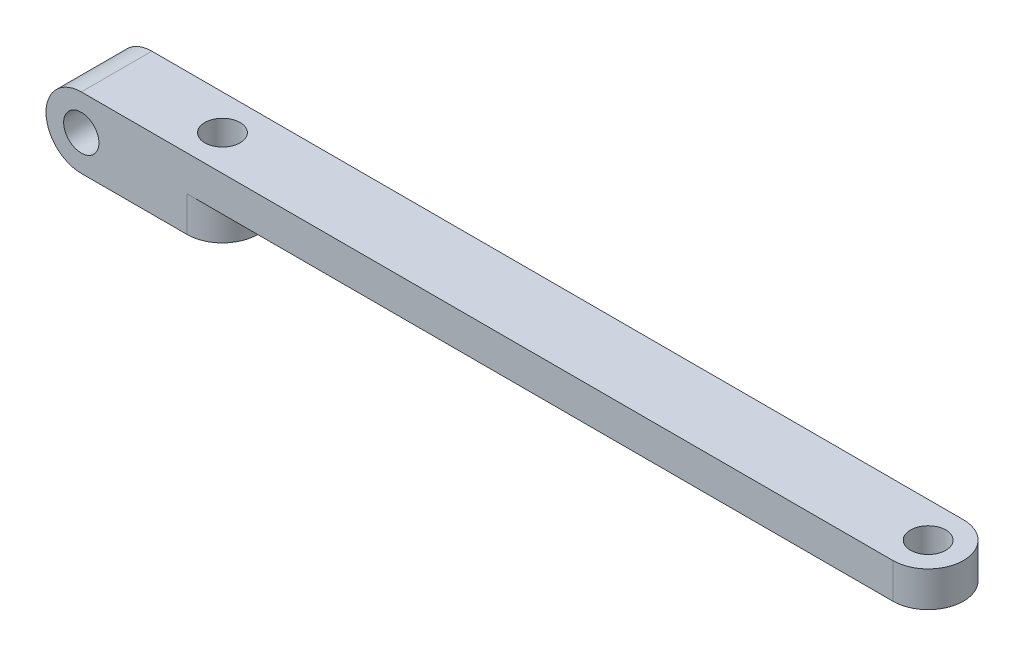
ISO-10303-21;
HEADER;
FILE_DESCRIPTION(('STEP AP214'),'2;1');
FILE_NAME('part.step','',(''),(''),'','','');
FILE_SCHEMA(('AUTOMOTIVE_DESIGN { 1 0 10303 214 1 1 1 1 }'));
ENDSEC;
DATA;
#1=APPLICATION_CONTEXT('core data for automotive mechanical design processes');
#2=APPLICATION_PROTOCOL_DEFINITION('international standard','automotive_design',2000,#1);
#3=PRODUCT_CONTEXT('',#1,'mechanical');
#4=PRODUCT('Part','Part','',(#3));
#5=PRODUCT_RELATED_PRODUCT_CATEGORY('part','',(#4));
#6=PRODUCT_DEFINITION_FORMATION('','',#4);
#7=PRODUCT_DEFINITION_CONTEXT('part definition',#1,'design');
#8=PRODUCT_DEFINITION('design','',#6,#7);
#9=PRODUCT_DEFINITION_SHAPE('','',#8);
#10=(LENGTH_UNIT() NAMED_UNIT(*) SI_UNIT(.MILLI.,.METRE.));
#11=(NAMED_UNIT(*) PLANE_ANGLE_UNIT() SI_UNIT($,.RADIAN.));
#12=(NAMED_UNIT(*) SI_UNIT($,.STERADIAN.) SOLID_ANGLE_UNIT());
#13=UNCERTAINTY_MEASURE_WITH_UNIT(LENGTH_MEASURE(1.E-05),#10,'distance_accuracy_value','');
#14=(GEOMETRIC_REPRESENTATION_CONTEXT(3) GLOBAL_UNCERTAINTY_ASSIGNED_CONTEXT((#13)) GLOBAL_UNIT_ASSIGNED_CONTEXT((#10,
#11,#12)) REPRESENTATION_CONTEXT('',''));
#15=CARTESIAN_POINT('',(0.,0.,0.));
#16=DIRECTION('',(0.,0.,1.));
#17=DIRECTION('',(1.,0.,0.));
#18=AXIS2_PLACEMENT_3D('',#15,#16,#17);
#19=CARTESIAN_POINT('',(6.,2.,2.));
#20=DIRECTION('',(0.,-1.,0.));
#21=DIRECTION('',(0.,0.,-1.));
#22=AXIS2_PLACEMENT_3D('',#19,#20,#21);
#23=CYLINDRICAL_SURFACE('',#22,2.);
#24=CARTESIAN_POINT('',(6.,0.,2.));
#25=DIRECTION('',(0.,1.,0.));
#26=DIRECTION('',(0.,0.,1.));
#27=AXIS2_PLACEMENT_3D('',#24,#25,#26);
#28=CIRCLE('',#27,2.);
#29=CARTESIAN_POINT('',(6.,0.,4.));
#30=VERTEX_POINT('',#29);
#31=CARTESIAN_POINT('',(6.,0.,0.));
#32=VERTEX_POINT('',#31);
#33=EDGE_CURVE('E125',#30,#32,#28,.T.);
#34=ORIENTED_EDGE('',*,*,#33,.F.);
#35=DIRECTION('',(0.,-1.,0.));
#36=VECTOR('',#35,1.);
#37=CARTESIAN_POINT('',(6.,2.,4.));
#38=LINE('',#37,#36);
#39=CARTESIAN_POINT('',(6.,-2.,4.));
#40=VERTEX_POINT('',#39);
#41=EDGE_CURVE('E140',#30,#40,#38,.T.);
#42=ORIENTED_EDGE('',*,*,#41,.T.);
#43=CARTESIAN_POINT('',(6.,-2.,2.));
#44=DIRECTION('',(0.,1.,0.));
#45=DIRECTION('',(0.,0.,-1.));
#46=AXIS2_PLACEMENT_3D('',#43,#44,#45);
#47=CIRCLE('',#46,2.);
#48=CARTESIAN_POINT('',(6.,-2.,0.));
#49=VERTEX_POINT('',#48);
#50=EDGE_CURVE('E135',#40,#49,#47,.T.);
#51=ORIENTED_EDGE('',*,*,#50,.T.);
#52=DIRECTION('',(0.,-1.,0.));
#53=VECTOR('',#52,1.);
#54=CARTESIAN_POINT('',(6.,2.,0.));
#55=LINE('',#54,#53);
#56=EDGE_CURVE('E58',#32,#49,#55,.T.);
#57=ORIENTED_EDGE('',*,*,#56,.F.);
#58=EDGE_LOOP('',(#34,#42,#51,#57));
#59=FACE_BOUND('',#58,.T.);
#60=ADVANCED_FACE('F43',(#59),#23,.T.);
#61=CARTESIAN_POINT('',(0.,0.,4.));
#62=DIRECTION('',(0.,0.,-1.));
#63=DIRECTION('',(-1.,0.,0.));
#64=AXIS2_PLACEMENT_3D('',#61,#62,#63);
#65=CYLINDRICAL_SURFACE('',#64,2.);
#66=DIRECTION('',(0.,0.,1.));
#67=VECTOR('',#66,1.);
#68=CARTESIAN_POINT('',(0.,-2.,0.));
#69=LINE('',#68,#67);
#70=CARTESIAN_POINT('',(0.,-2.,0.));
#71=VERTEX_POINT('',#70);
#72=CARTESIAN_POINT('',(0.,-2.,4.));
#73=VERTEX_POINT('',#72);
#74=EDGE_CURVE('E66',#71,#73,#69,.T.);
#75=ORIENTED_EDGE('',*,*,#74,.T.);
#76=CARTESIAN_POINT('',(0.,0.,4.));
#77=DIRECTION('',(0.,0.,1.));
#78=DIRECTION('',(1.,0.,0.));
#79=AXIS2_PLACEMENT_3D('',#76,#77,#78);
#80=CIRCLE('',#79,2.);
#81=CARTESIAN_POINT('',(0.,2.,4.));
#82=VERTEX_POINT('',#81);
#83=EDGE_CURVE('E11',#82,#73,#80,.T.);
#84=ORIENTED_EDGE('',*,*,#83,.F.);
#85=DIRECTION('',(0.,0.,1.));
#86=VECTOR('',#85,1.);
#87=CARTESIAN_POINT('',(0.,2.,0.));
#88=LINE('',#87,#86);
#89=CARTESIAN_POINT('',(0.,2.,0.));
#90=VERTEX_POINT('',#89);
#91=EDGE_CURVE('E107',#90,#82,#88,.T.);
#92=ORIENTED_EDGE('',*,*,#91,.F.);
#93=CARTESIAN_POINT('',(0.,0.,0.));
#94=DIRECTION('',(0.,0.,1.));
#95=DIRECTION('',(1.,0.,0.));
#96=AXIS2_PLACEMENT_3D('',#93,#94,#95);
#97=CIRCLE('',#96,2.);
#98=EDGE_CURVE('E47',#90,#71,#97,.T.);
#99=ORIENTED_EDGE('',*,*,#98,.T.);
#100=EDGE_LOOP('',(#75,#84,#92,#99));
#101=FACE_BOUND('',#100,.T.);
#102=ADVANCED_FACE('F45',(#101),#65,.T.);
#103=CARTESIAN_POINT('',(0.,0.,4.));
#104=DIRECTION('',(0.,0.,1.));
#105=DIRECTION('',(1.,0.,0.));
#106=AXIS2_PLACEMENT_3D('',#103,#104,#105);
#107=PLANE('',#106);
#108=CARTESIAN_POINT('',(0.,0.,4.));
#109=DIRECTION('',(0.,0.,1.));
#110=DIRECTION('',(1.,0.,0.));
#111=AXIS2_PLACEMENT_3D('',#108,#109,#110);
#112=CIRCLE('',#111,1.);
#113=CARTESIAN_POINT('',(1.,0.,4.));
#114=VERTEX_POINT('',#113);
#115=EDGE_CURVE('E142',#114,#114,#112,.T.);
#116=ORIENTED_EDGE('',*,*,#115,.F.);
#117=EDGE_LOOP('',(#116));
#118=FACE_BOUND('',#117,.T.);
#119=ORIENTED_EDGE('',*,*,#83,.T.);
#120=DIRECTION('',(-1.,0.,0.));
#121=VECTOR('',#120,1.);
#122=CARTESIAN_POINT('',(0.,-2.,4.));
#123=LINE('',#122,#121);
#124=EDGE_CURVE('E146',#40,#73,#123,.T.);
#125=ORIENTED_EDGE('',*,*,#124,.F.);
#126=ORIENTED_EDGE('',*,*,#41,.F.);
#127=DIRECTION('',(1.,0.,0.));
#128=VECTOR('',#127,1.);
#129=CARTESIAN_POINT('',(46.,0.,3.99999999999999));
#130=LINE('',#129,#128);
#131=CARTESIAN_POINT('',(46.,0.,3.99999999999999));
#132=VERTEX_POINT('',#131);
#133=EDGE_CURVE('E120',#30,#132,#130,.T.);
#134=ORIENTED_EDGE('',*,*,#133,.T.);
#135=DIRECTION('',(0.,-1.,0.));
#136=VECTOR('',#135,1.);
#137=CARTESIAN_POINT('',(46.,2.,3.99999999999999));
#138=LINE('',#137,#136);
#139=CARTESIAN_POINT('',(46.,2.,3.99999999999999));
#140=VERTEX_POINT('',#139);
#141=EDGE_CURVE('E119',#140,#132,#138,.T.);
#142=ORIENTED_EDGE('',*,*,#141,.F.);
#143=DIRECTION('',(1.,0.,0.));
#144=VECTOR('',#143,1.);
#145=CARTESIAN_POINT('',(0.,2.,4.));
#146=LINE('',#145,#144);
#147=EDGE_CURVE('E115',#82,#140,#146,.T.);
#148=ORIENTED_EDGE('',*,*,#147,.F.);
#149=EDGE_LOOP('',(#119,#125,#126,#134,#142,#148));
#150=FACE_BOUND('',#149,.T.);
#151=ADVANCED_FACE('F155',(#118,#150),#107,.T.);
#152=CARTESIAN_POINT('',(0.,0.,0.));
#153=DIRECTION('',(0.,0.,1.));
#154=DIRECTION('',(1.,0.,0.));
#155=AXIS2_PLACEMENT_3D('',#152,#153,#154);
#156=PLANE('',#155);
#157=CARTESIAN_POINT('',(0.,0.,0.));
#158=DIRECTION('',(0.,0.,1.));
#159=DIRECTION('',(1.,0.,0.));
#160=AXIS2_PLACEMENT_3D('',#157,#158,#159);
#161=CIRCLE('',#160,1.);
#162=CARTESIAN_POINT('',(1.,0.,0.));
#163=VERTEX_POINT('',#162);
#164=EDGE_CURVE('E143',#163,#163,#161,.T.);
#165=ORIENTED_EDGE('',*,*,#164,.T.);
#166=EDGE_LOOP('',(#165));
#167=FACE_BOUND('',#166,.T.);
#168=ORIENTED_EDGE('',*,*,#98,.F.);
#169=DIRECTION('',(1.,0.,0.));
#170=VECTOR('',#169,1.);
#171=CARTESIAN_POINT('',(0.,2.,0.));
#172=LINE('',#171,#170);
#173=CARTESIAN_POINT('',(46.,2.,0.));
#174=VERTEX_POINT('',#173);
#175=EDGE_CURVE('E96',#90,#174,#172,.T.);
#176=ORIENTED_EDGE('',*,*,#175,.T.);
#177=DIRECTION('',(0.,-1.,0.));
#178=VECTOR('',#177,1.);
#179=CARTESIAN_POINT('',(46.,2.,0.));
#180=LINE('',#179,#178);
#181=CARTESIAN_POINT('',(46.,0.,0.));
#182=VERTEX_POINT('',#181);
#183=EDGE_CURVE('E101',#174,#182,#180,.T.);
#184=ORIENTED_EDGE('',*,*,#183,.T.);
#185=DIRECTION('',(-1.,0.,0.));
#186=VECTOR('',#185,1.);
#187=CARTESIAN_POINT('',(46.,0.,0.));
#188=LINE('',#187,#186);
#189=EDGE_CURVE('E160',#182,#32,#188,.T.);
#190=ORIENTED_EDGE('',*,*,#189,.T.);
#191=ORIENTED_EDGE('',*,*,#56,.T.);
#192=DIRECTION('',(-1.,0.,0.));
#193=VECTOR('',#192,1.);
#194=CARTESIAN_POINT('',(0.,-2.,0.));
#195=LINE('',#194,#193);
#196=EDGE_CURVE('E108',#49,#71,#195,.T.);
#197=ORIENTED_EDGE('',*,*,#196,.T.);
#198=EDGE_LOOP('',(#168,#176,#184,#190,#191,#197));
#199=FACE_BOUND('',#198,.T.);
#200=ADVANCED_FACE('F98',(#167,#199),#156,.F.);
#201=CARTESIAN_POINT('',(0.,-2.,0.));
#202=DIRECTION('',(0.,1.,0.));
#203=DIRECTION('',(-1.,0.,0.));
#204=AXIS2_PLACEMENT_3D('',#201,#202,#203);
#205=PLANE('',#204);
#206=ORIENTED_EDGE('',*,*,#124,.T.);
#207=ORIENTED_EDGE('',*,*,#74,.F.);
#208=ORIENTED_EDGE('',*,*,#196,.F.);
#209=ORIENTED_EDGE('',*,*,#50,.F.);
#210=EDGE_LOOP('',(#206,#207,#208,#209));
#211=FACE_BOUND('',#210,.T.);
#212=CARTESIAN_POINT('',(6.,-2.,2.));
#213=DIRECTION('',(0.,1.,0.));
#214=DIRECTION('',(0.,0.,1.));
#215=AXIS2_PLACEMENT_3D('',#212,#213,#214);
#216=CIRCLE('',#215,1.);
#217=CARTESIAN_POINT('',(6.,-2.,3.));
#218=VERTEX_POINT('',#217);
#219=EDGE_CURVE('E127',#218,#218,#216,.T.);
#220=ORIENTED_EDGE('',*,*,#219,.T.);
#221=EDGE_LOOP('',(#220));
#222=FACE_BOUND('',#221,.T.);
#223=ADVANCED_FACE('F197',(#211,#222),#205,.F.);
#224=CARTESIAN_POINT('',(0.,2.,0.));
#225=DIRECTION('',(0.,-1.,0.));
#226=DIRECTION('',(1.,0.,0.));
#227=AXIS2_PLACEMENT_3D('',#224,#225,#226);
#228=PLANE('',#227);
#229=CARTESIAN_POINT('',(46.,2.,2.));
#230=DIRECTION('',(0.,1.,0.));
#231=DIRECTION('',(0.,0.,1.));
#232=AXIS2_PLACEMENT_3D('',#229,#230,#231);
#233=CIRCLE('',#232,2.);
#234=EDGE_CURVE('E111',#140,#174,#233,.T.);
#235=ORIENTED_EDGE('',*,*,#234,.T.);
#236=ORIENTED_EDGE('',*,*,#175,.F.);
#237=ORIENTED_EDGE('',*,*,#91,.T.);
#238=ORIENTED_EDGE('',*,*,#147,.T.);
#239=EDGE_LOOP('',(#235,#236,#237,#238));
#240=FACE_BOUND('',#239,.T.);
#241=CARTESIAN_POINT('',(6.,2.,2.));
#242=DIRECTION('',(0.,1.,0.));
#243=DIRECTION('',(0.,0.,1.));
#244=AXIS2_PLACEMENT_3D('',#241,#242,#243);
#245=CIRCLE('',#244,1.);
#246=CARTESIAN_POINT('',(6.,2.,3.));
#247=VERTEX_POINT('',#246);
#248=EDGE_CURVE('E132',#247,#247,#245,.T.);
#249=ORIENTED_EDGE('',*,*,#248,.F.);
#250=EDGE_LOOP('',(#249));
#251=FACE_BOUND('',#250,.T.);
#252=CARTESIAN_POINT('',(46.,2.,2.));
#253=DIRECTION('',(0.,1.,0.));
#254=DIRECTION('',(0.,0.,1.));
#255=AXIS2_PLACEMENT_3D('',#252,#253,#254);
#256=CIRCLE('',#255,0.999999999999998);
#257=CARTESIAN_POINT('',(46.,2.,2.99999999999999));
#258=VERTEX_POINT('',#257);
#259=EDGE_CURVE('E161',#258,#258,#256,.T.);
#260=ORIENTED_EDGE('',*,*,#259,.F.);
#261=EDGE_LOOP('',(#260));
#262=FACE_BOUND('',#261,.T.);
#263=ADVANCED_FACE('F112',(#240,#251,#262),#228,.F.);
#264=CARTESIAN_POINT('',(0.,0.,0.));
#265=DIRECTION('',(0.,0.,1.));
#266=DIRECTION('',(1.,0.,0.));
#267=AXIS2_PLACEMENT_3D('',#264,#265,#266);
#268=CYLINDRICAL_SURFACE('',#267,1.);
#269=ORIENTED_EDGE('',*,*,#164,.F.);
#270=EDGE_LOOP('',(#269));
#271=FACE_BOUND('',#270,.T.);
#272=ORIENTED_EDGE('',*,*,#115,.T.);
#273=EDGE_LOOP('',(#272));
#274=FACE_BOUND('',#273,.T.);
#275=ADVANCED_FACE('F191',(#271,#274),#268,.F.);
#276=CARTESIAN_POINT('',(6.,2.,2.));
#277=DIRECTION('',(0.,-1.,0.));
#278=DIRECTION('',(0.,0.,-1.));
#279=AXIS2_PLACEMENT_3D('',#276,#277,#278);
#280=CYLINDRICAL_SURFACE('',#279,1.);
#281=ORIENTED_EDGE('',*,*,#248,.T.);
#282=EDGE_LOOP('',(#281));
#283=FACE_BOUND('',#282,.T.);
#284=ORIENTED_EDGE('',*,*,#219,.F.);
#285=EDGE_LOOP('',(#284));
#286=FACE_BOUND('',#285,.T.);
#287=ADVANCED_FACE('F190',(#283,#286),#280,.F.);
#288=CARTESIAN_POINT('',(46.,0.,2.));
#289=DIRECTION('',(0.,1.,0.));
#290=DIRECTION('',(0.,0.,1.));
#291=AXIS2_PLACEMENT_3D('',#288,#289,#290);
#292=PLANE('',#291);
#293=CARTESIAN_POINT('',(46.,0.,2.));
#294=DIRECTION('',(0.,1.,0.));
#295=DIRECTION('',(0.,0.,1.));
#296=AXIS2_PLACEMENT_3D('',#293,#294,#295);
#297=CIRCLE('',#296,0.999999999999998);
#298=CARTESIAN_POINT('',(46.,0.,2.99999999999999));
#299=VERTEX_POINT('',#298);
#300=EDGE_CURVE('E165',#299,#299,#297,.T.);
#301=ORIENTED_EDGE('',*,*,#300,.T.);
#302=EDGE_LOOP('',(#301));
#303=FACE_BOUND('',#302,.T.);
#304=ORIENTED_EDGE('',*,*,#133,.F.);
#305=ORIENTED_EDGE('',*,*,#33,.T.);
#306=ORIENTED_EDGE('',*,*,#189,.F.);
#307=CARTESIAN_POINT('',(46.,0.,2.));
#308=DIRECTION('',(0.,1.,0.));
#309=DIRECTION('',(0.,0.,1.));
#310=AXIS2_PLACEMENT_3D('',#307,#308,#309);
#311=CIRCLE('',#310,2.);
#312=EDGE_CURVE('E124',#132,#182,#311,.T.);
#313=ORIENTED_EDGE('',*,*,#312,.F.);
#314=EDGE_LOOP('',(#304,#305,#306,#313));
#315=FACE_BOUND('',#314,.T.);
#316=ADVANCED_FACE('F159',(#303,#315),#292,.F.);
#317=CARTESIAN_POINT('',(46.,2.,2.));
#318=DIRECTION('',(0.,-1.,0.));
#319=DIRECTION('',(0.,0.,-1.));
#320=AXIS2_PLACEMENT_3D('',#317,#318,#319);
#321=CYLINDRICAL_SURFACE('',#320,2.);
#322=ORIENTED_EDGE('',*,*,#312,.T.);
#323=ORIENTED_EDGE('',*,*,#183,.F.);
#324=ORIENTED_EDGE('',*,*,#234,.F.);
#325=ORIENTED_EDGE('',*,*,#141,.T.);
#326=EDGE_LOOP('',(#322,#323,#324,#325));
#327=FACE_BOUND('',#326,.T.);
#328=ADVANCED_FACE('F122',(#327),#321,.T.);
#329=CARTESIAN_POINT('',(46.,2.,2.));
#330=DIRECTION('',(0.,-1.,0.));
#331=DIRECTION('',(0.,0.,-1.));
#332=AXIS2_PLACEMENT_3D('',#329,#330,#331);
#333=CYLINDRICAL_SURFACE('',#332,0.999999999999998);
#334=ORIENTED_EDGE('',*,*,#259,.T.);
#335=EDGE_LOOP('',(#334));
#336=FACE_BOUND('',#335,.T.);
#337=ORIENTED_EDGE('',*,*,#300,.F.);
#338=EDGE_LOOP('',(#337));
#339=FACE_BOUND('',#338,.T.);
#340=ADVANCED_FACE('F172',(#336,#339),#333,.F.);
#341=CLOSED_SHELL('',(#60,#102,#151,#200,#223,#263,#275,#287,#316,#328,#340));
#342=MANIFOLD_SOLID_BREP('B2',#341);
#343=ADVANCED_BREP_SHAPE_REPRESENTATION('',(#18,#342),#14);
#344=SHAPE_DEFINITION_REPRESENTATION(#9,#343);
ENDSEC;
END-ISO-10303-21;
